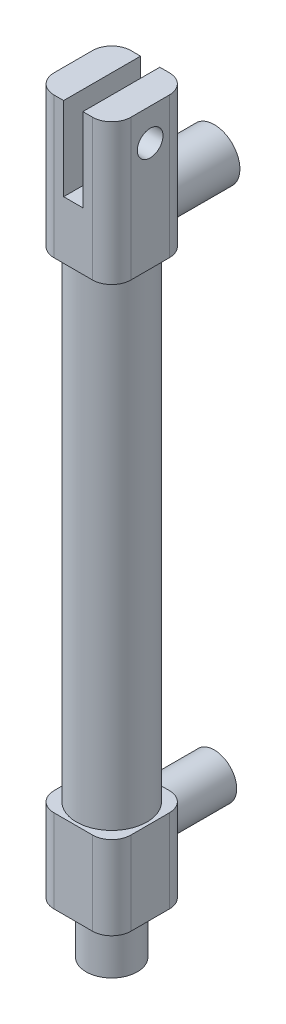
ISO-10303-21;
HEADER;
FILE_DESCRIPTION(('STEP AP214'),'2;1');
FILE_NAME('part.step','',(''),(''),'','','');
FILE_SCHEMA(('AUTOMOTIVE_DESIGN { 1 0 10303 214 1 1 1 1 }'));
ENDSEC;
DATA;
#1=APPLICATION_CONTEXT('core data for automotive mechanical design processes');
#2=APPLICATION_PROTOCOL_DEFINITION('international standard','automotive_design',2000,#1);
#3=PRODUCT_CONTEXT('',#1,'mechanical');
#4=PRODUCT('Part','Part','',(#3));
#5=PRODUCT_RELATED_PRODUCT_CATEGORY('part','',(#4));
#6=PRODUCT_DEFINITION_FORMATION('','',#4);
#7=PRODUCT_DEFINITION_CONTEXT('part definition',#1,'design');
#8=PRODUCT_DEFINITION('design','',#6,#7);
#9=PRODUCT_DEFINITION_SHAPE('','',#8);
#10=(LENGTH_UNIT() NAMED_UNIT(*) SI_UNIT(.MILLI.,.METRE.));
#11=(NAMED_UNIT(*) PLANE_ANGLE_UNIT() SI_UNIT($,.RADIAN.));
#12=(NAMED_UNIT(*) SI_UNIT($,.STERADIAN.) SOLID_ANGLE_UNIT());
#13=UNCERTAINTY_MEASURE_WITH_UNIT(LENGTH_MEASURE(1.E-05),#10,'distance_accuracy_value','');
#14=(GEOMETRIC_REPRESENTATION_CONTEXT(3) GLOBAL_UNCERTAINTY_ASSIGNED_CONTEXT((#13)) GLOBAL_UNIT_ASSIGNED_CONTEXT((#10,
#11,#12)) REPRESENTATION_CONTEXT('',''));
#15=CARTESIAN_POINT('',(0.,0.,0.));
#16=DIRECTION('',(0.,0.,1.));
#17=DIRECTION('',(1.,0.,0.));
#18=AXIS2_PLACEMENT_3D('',#15,#16,#17);
#19=CARTESIAN_POINT('',(-57.059570611941,-13.,-8.24925290826831));
#20=DIRECTION('',(0.,1.,0.));
#21=DIRECTION('',(0.,0.,1.));
#22=AXIS2_PLACEMENT_3D('',#19,#20,#21);
#23=PLANE('',#22);
#24=CARTESIAN_POINT('',(-57.059570611941,-13.,-8.24925290826831));
#25=DIRECTION('',(0.,-1.,0.));
#26=DIRECTION('',(0.,0.,1.));
#27=AXIS2_PLACEMENT_3D('',#24,#25,#26);
#28=CIRCLE('',#27,3.);
#29=CARTESIAN_POINT('',(-54.059570611941,-13.,-8.24925290826833));
#30=VERTEX_POINT('',#29);
#31=CARTESIAN_POINT('',(-57.059570611941,-13.,-5.24925290826831));
#32=VERTEX_POINT('',#31);
#33=EDGE_CURVE('E807',#30,#32,#28,.T.);
#34=ORIENTED_EDGE('',*,*,#33,.T.);
#35=DIRECTION('',(-1.,0.,0.));
#36=VECTOR('',#35,1.);
#37=CARTESIAN_POINT('',(-57.059570611941,-13.,-5.24925290826831));
#38=LINE('',#37,#36);
#39=CARTESIAN_POINT('',(-63.059570611941,-13.,-5.24925290826831));
#40=VERTEX_POINT('',#39);
#41=EDGE_CURVE('E809',#32,#40,#38,.T.);
#42=ORIENTED_EDGE('',*,*,#41,.T.);
#43=CARTESIAN_POINT('',(-63.059570611941,-13.,-8.24925290826831));
#44=DIRECTION('',(0.,-1.,0.));
#45=DIRECTION('',(0.,0.,-1.));
#46=AXIS2_PLACEMENT_3D('',#43,#44,#45);
#47=CIRCLE('',#46,3.);
#48=CARTESIAN_POINT('',(-66.059570611941,-13.,-8.24925290826833));
#49=VERTEX_POINT('',#48);
#50=EDGE_CURVE('E812',#40,#49,#47,.T.);
#51=ORIENTED_EDGE('',*,*,#50,.T.);
#52=DIRECTION('',(0.,0.,-1.));
#53=VECTOR('',#52,1.);
#54=CARTESIAN_POINT('',(-66.059570611941,-13.,-14.2492529082683));
#55=LINE('',#54,#53);
#56=CARTESIAN_POINT('',(-66.059570611941,-13.,-14.2492529082683));
#57=VERTEX_POINT('',#56);
#58=EDGE_CURVE('E814',#49,#57,#55,.T.);
#59=ORIENTED_EDGE('',*,*,#58,.T.);
#60=CARTESIAN_POINT('',(-63.059570611941,-13.,-14.2492529082683));
#61=DIRECTION('',(0.,-1.,0.));
#62=DIRECTION('',(0.,0.,-1.));
#63=AXIS2_PLACEMENT_3D('',#60,#61,#62);
#64=CIRCLE('',#63,3.);
#65=CARTESIAN_POINT('',(-63.059570611941,-13.,-17.2492529082683));
#66=VERTEX_POINT('',#65);
#67=EDGE_CURVE('E816',#57,#66,#64,.T.);
#68=ORIENTED_EDGE('',*,*,#67,.T.);
#69=DIRECTION('',(1.,0.,0.));
#70=VECTOR('',#69,1.);
#71=CARTESIAN_POINT('',(-57.059570611941,-13.,-17.2492529082683));
#72=LINE('',#71,#70);
#73=CARTESIAN_POINT('',(-57.059570611941,-13.,-17.2492529082683));
#74=VERTEX_POINT('',#73);
#75=EDGE_CURVE('E818',#66,#74,#72,.T.);
#76=ORIENTED_EDGE('',*,*,#75,.T.);
#77=CARTESIAN_POINT('',(-57.059570611941,-13.,-14.2492529082683));
#78=DIRECTION('',(0.,-1.,0.));
#79=DIRECTION('',(0.,0.,1.));
#80=AXIS2_PLACEMENT_3D('',#77,#78,#79);
#81=CIRCLE('',#80,3.);
#82=CARTESIAN_POINT('',(-54.059570611941,-13.,-14.2492529082683));
#83=VERTEX_POINT('',#82);
#84=EDGE_CURVE('E820',#74,#83,#81,.T.);
#85=ORIENTED_EDGE('',*,*,#84,.T.);
#86=DIRECTION('',(0.,0.,1.));
#87=VECTOR('',#86,1.);
#88=CARTESIAN_POINT('',(-54.059570611941,-13.,-14.2492529082683));
#89=LINE('',#88,#87);
#90=EDGE_CURVE('E822',#83,#30,#89,.T.);
#91=ORIENTED_EDGE('',*,*,#90,.T.);
#92=EDGE_LOOP('',(#34,#42,#51,#59,#68,#76,#85,#91));
#93=FACE_BOUND('',#92,.T.);
#94=CARTESIAN_POINT('',(-60.059570611941,-13.,-11.2492529082683));
#95=DIRECTION('',(0.,1.,0.));
#96=DIRECTION('',(0.,0.,1.));
#97=AXIS2_PLACEMENT_3D('',#94,#95,#96);
#98=CIRCLE('',#97,4.00000000000001);
#99=CARTESIAN_POINT('',(-60.059570611941,-13.,-7.2492529082683));
#100=VERTEX_POINT('',#99);
#101=EDGE_CURVE('E11',#100,#100,#98,.F.);
#102=ORIENTED_EDGE('',*,*,#101,.F.);
#103=EDGE_LOOP('',(#102));
#104=FACE_BOUND('',#103,.T.);
#105=ADVANCED_FACE('F32',(#93,#104),#23,.F.);
#106=CARTESIAN_POINT('',(-57.059570611941,-13.,-17.2492529082683));
#107=DIRECTION('',(0.,0.,1.));
#108=DIRECTION('',(1.,0.,0.));
#109=AXIS2_PLACEMENT_3D('',#106,#107,#108);
#110=PLANE('',#109);
#111=CARTESIAN_POINT('',(-60.059570611941,-4.5,-17.2492529082683));
#112=DIRECTION('',(0.,0.,-1.));
#113=DIRECTION('',(-1.,0.,0.));
#114=AXIS2_PLACEMENT_3D('',#111,#112,#113);
#115=CIRCLE('',#114,3.5);
#116=CARTESIAN_POINT('',(-57.059570611941,-6.30277563773199,-17.2492529082683));
#117=VERTEX_POINT('',#116);
#118=CARTESIAN_POINT('',(-63.059570611941,-6.30277563773202,-17.2492529082683));
#119=VERTEX_POINT('',#118);
#120=EDGE_CURVE('E209',#117,#119,#115,.T.);
#121=ORIENTED_EDGE('',*,*,#120,.F.);
#122=DIRECTION('',(0.,1.,0.));
#123=VECTOR('',#122,1.);
#124=CARTESIAN_POINT('',(-57.059570611941,-13.,-17.2492529082683));
#125=LINE('',#124,#123);
#126=EDGE_CURVE('E227',#74,#117,#125,.T.);
#127=ORIENTED_EDGE('',*,*,#126,.F.);
#128=ORIENTED_EDGE('',*,*,#75,.F.);
#129=DIRECTION('',(0.,1.,0.));
#130=VECTOR('',#129,1.);
#131=CARTESIAN_POINT('',(-63.059570611941,-13.,-17.2492529082683));
#132=LINE('',#131,#130);
#133=EDGE_CURVE('E226',#66,#119,#132,.T.);
#134=ORIENTED_EDGE('',*,*,#133,.T.);
#135=EDGE_LOOP('',(#121,#127,#128,#134));
#136=FACE_BOUND('',#135,.T.);
#137=ADVANCED_FACE('F385',(#136),#110,.F.);
#138=CARTESIAN_POINT('',(-63.059570611941,-2.69722436226798,-17.2492529082683));
#139=VERTEX_POINT('',#138);
#140=CARTESIAN_POINT('',(-57.059570611941,-2.69722436226801,-17.2492529082683));
#141=VERTEX_POINT('',#140);
#142=EDGE_CURVE('E47',#139,#141,#115,.T.);
#143=ORIENTED_EDGE('',*,*,#142,.F.);
#144=CARTESIAN_POINT('',(-63.059570611941,0.,-17.2492529082683));
#145=VERTEX_POINT('',#144);
#146=EDGE_CURVE('E216',#139,#145,#132,.T.);
#147=ORIENTED_EDGE('',*,*,#146,.T.);
#148=DIRECTION('',(1.,0.,0.));
#149=VECTOR('',#148,1.);
#150=CARTESIAN_POINT('',(-57.059570611941,0.,-17.2492529082683));
#151=LINE('',#150,#149);
#152=CARTESIAN_POINT('',(-57.059570611941,0.,-17.2492529082683));
#153=VERTEX_POINT('',#152);
#154=EDGE_CURVE('E834',#145,#153,#151,.T.);
#155=ORIENTED_EDGE('',*,*,#154,.T.);
#156=EDGE_CURVE('E218',#141,#153,#125,.T.);
#157=ORIENTED_EDGE('',*,*,#156,.F.);
#158=EDGE_LOOP('',(#143,#147,#155,#157));
#159=FACE_BOUND('',#158,.T.);
#160=ADVANCED_FACE('F214',(#159),#110,.F.);
#161=CARTESIAN_POINT('',(-63.059570611941,97.,-17.2492529082683));
#162=DIRECTION('',(0.,0.,1.));
#163=DIRECTION('',(1.,0.,0.));
#164=AXIS2_PLACEMENT_3D('',#161,#162,#163);
#165=PLANE('',#164);
#166=CARTESIAN_POINT('',(-60.059570611941,79.5,-17.2492529082683));
#167=DIRECTION('',(0.,0.,-1.));
#168=DIRECTION('',(-1.,0.,0.));
#169=AXIS2_PLACEMENT_3D('',#166,#167,#168);
#170=CIRCLE('',#169,4.);
#171=CARTESIAN_POINT('',(-57.059570611941,76.8542486889354,-17.2492529082683));
#172=VERTEX_POINT('',#171);
#173=CARTESIAN_POINT('',(-63.059570611941,76.8542486889354,-17.2492529082683));
#174=VERTEX_POINT('',#173);
#175=EDGE_CURVE('E55',#172,#174,#170,.T.);
#176=ORIENTED_EDGE('',*,*,#175,.F.);
#177=DIRECTION('',(0.,-1.,0.));
#178=VECTOR('',#177,1.);
#179=CARTESIAN_POINT('',(-57.059570611941,97.,-17.2492529082683));
#180=LINE('',#179,#178);
#181=CARTESIAN_POINT('',(-57.059570611941,75.,-17.2492529082683));
#182=VERTEX_POINT('',#181);
#183=EDGE_CURVE('E348',#172,#182,#180,.T.);
#184=ORIENTED_EDGE('',*,*,#183,.T.);
#185=DIRECTION('',(-1.,0.,0.));
#186=VECTOR('',#185,1.);
#187=CARTESIAN_POINT('',(-63.059570611941,75.,-17.2492529082683));
#188=LINE('',#187,#186);
#189=CARTESIAN_POINT('',(-63.059570611941,75.,-17.2492529082683));
#190=VERTEX_POINT('',#189);
#191=EDGE_CURVE('E323',#182,#190,#188,.T.);
#192=ORIENTED_EDGE('',*,*,#191,.T.);
#193=DIRECTION('',(0.,-1.,0.));
#194=VECTOR('',#193,1.);
#195=CARTESIAN_POINT('',(-63.059570611941,97.,-17.2492529082683));
#196=LINE('',#195,#194);
#197=EDGE_CURVE('E344',#174,#190,#196,.T.);
#198=ORIENTED_EDGE('',*,*,#197,.F.);
#199=EDGE_LOOP('',(#176,#184,#192,#198));
#200=FACE_BOUND('',#199,.T.);
#201=ADVANCED_FACE('F479',(#200),#165,.F.);
#202=CARTESIAN_POINT('',(-63.059570611941,82.1457513110646,-17.2492529082683));
#203=VERTEX_POINT('',#202);
#204=CARTESIAN_POINT('',(-57.059570611941,82.1457513110646,-17.2492529082683));
#205=VERTEX_POINT('',#204);
#206=EDGE_CURVE('E253',#203,#205,#170,.T.);
#207=ORIENTED_EDGE('',*,*,#206,.F.);
#208=CARTESIAN_POINT('',(-63.059570611941,97.,-17.2492529082683));
#209=VERTEX_POINT('',#208);
#210=EDGE_CURVE('E345',#209,#203,#196,.T.);
#211=ORIENTED_EDGE('',*,*,#210,.F.);
#212=DIRECTION('',(-1.,0.,0.));
#213=VECTOR('',#212,1.);
#214=CARTESIAN_POINT('',(-63.059570611941,97.,-17.2492529082683));
#215=LINE('',#214,#213);
#216=CARTESIAN_POINT('',(-61.559570611941,97.,-17.2492529082683));
#217=VERTEX_POINT('',#216);
#218=EDGE_CURVE('E301',#217,#209,#215,.T.);
#219=ORIENTED_EDGE('',*,*,#218,.F.);
#220=DIRECTION('',(0.,1.,0.));
#221=VECTOR('',#220,1.);
#222=CARTESIAN_POINT('',(-61.559570611941,84.,-17.2492529082683));
#223=LINE('',#222,#221);
#224=CARTESIAN_POINT('',(-61.559570611941,84.,-17.2492529082683));
#225=VERTEX_POINT('',#224);
#226=EDGE_CURVE('E281',#225,#217,#223,.T.);
#227=ORIENTED_EDGE('',*,*,#226,.F.);
#228=DIRECTION('',(-1.,0.,0.));
#229=VECTOR('',#228,1.);
#230=CARTESIAN_POINT('',(-61.559570611941,84.,-17.2492529082683));
#231=LINE('',#230,#229);
#232=CARTESIAN_POINT('',(-58.559570611941,84.,-17.2492529082683));
#233=VERTEX_POINT('',#232);
#234=EDGE_CURVE('E262',#233,#225,#231,.T.);
#235=ORIENTED_EDGE('',*,*,#234,.F.);
#236=DIRECTION('',(0.,1.,0.));
#237=VECTOR('',#236,1.);
#238=CARTESIAN_POINT('',(-58.559570611941,84.,-17.2492529082683));
#239=LINE('',#238,#237);
#240=CARTESIAN_POINT('',(-58.559570611941,97.,-17.2492529082683));
#241=VERTEX_POINT('',#240);
#242=EDGE_CURVE('E272',#233,#241,#239,.T.);
#243=ORIENTED_EDGE('',*,*,#242,.T.);
#244=CARTESIAN_POINT('',(-57.059570611941,97.,-17.2492529082683));
#245=VERTEX_POINT('',#244);
#246=EDGE_CURVE('E302',#245,#241,#215,.T.);
#247=ORIENTED_EDGE('',*,*,#246,.F.);
#248=EDGE_CURVE('E350',#245,#205,#180,.T.);
#249=ORIENTED_EDGE('',*,*,#248,.T.);
#250=EDGE_LOOP('',(#207,#211,#219,#227,#235,#243,#247,#249));
#251=FACE_BOUND('',#250,.T.);
#252=ADVANCED_FACE('F453',(#251),#165,.F.);
#253=CARTESIAN_POINT('',(-57.059570611941,97.,-8.24925290826831));
#254=DIRECTION('',(0.,-1.,0.));
#255=DIRECTION('',(0.,0.,-1.));
#256=AXIS2_PLACEMENT_3D('',#253,#254,#255);
#257=PLANE('',#256);
#258=ORIENTED_EDGE('',*,*,#246,.T.);
#259=DIRECTION('',(0.,0.,-1.));
#260=VECTOR('',#259,1.);
#261=CARTESIAN_POINT('',(-58.559570611941,97.,-17.2492529082683));
#262=LINE('',#261,#260);
#263=CARTESIAN_POINT('',(-58.559570611941,97.,-5.24925290826831));
#264=VERTEX_POINT('',#263);
#265=EDGE_CURVE('E258',#264,#241,#262,.T.);
#266=ORIENTED_EDGE('',*,*,#265,.F.);
#267=DIRECTION('',(1.,0.,0.));
#268=VECTOR('',#267,1.);
#269=CARTESIAN_POINT('',(-63.059570611941,97.,-5.24925290826831));
#270=LINE('',#269,#268);
#271=CARTESIAN_POINT('',(-57.059570611941,97.,-5.24925290826831));
#272=VERTEX_POINT('',#271);
#273=EDGE_CURVE('E311',#264,#272,#270,.T.);
#274=ORIENTED_EDGE('',*,*,#273,.T.);
#275=CARTESIAN_POINT('',(-57.059570611941,97.,-8.24925290826831));
#276=DIRECTION('',(0.,1.,0.));
#277=DIRECTION('',(0.,0.,-1.));
#278=AXIS2_PLACEMENT_3D('',#275,#276,#277);
#279=CIRCLE('',#278,3.);
#280=CARTESIAN_POINT('',(-54.059570611941,97.,-8.24925290826834));
#281=VERTEX_POINT('',#280);
#282=EDGE_CURVE('E293',#272,#281,#279,.T.);
#283=ORIENTED_EDGE('',*,*,#282,.T.);
#284=DIRECTION('',(0.,0.,-1.));
#285=VECTOR('',#284,1.);
#286=CARTESIAN_POINT('',(-54.059570611941,97.,-14.2492529082683));
#287=LINE('',#286,#285);
#288=CARTESIAN_POINT('',(-54.059570611941,97.,-14.2492529082683));
#289=VERTEX_POINT('',#288);
#290=EDGE_CURVE('E296',#281,#289,#287,.T.);
#291=ORIENTED_EDGE('',*,*,#290,.T.);
#292=CARTESIAN_POINT('',(-57.059570611941,97.,-14.2492529082683));
#293=DIRECTION('',(0.,1.,0.));
#294=DIRECTION('',(0.,0.,-1.));
#295=AXIS2_PLACEMENT_3D('',#292,#293,#294);
#296=CIRCLE('',#295,3.);
#297=EDGE_CURVE('E299',#289,#245,#296,.T.);
#298=ORIENTED_EDGE('',*,*,#297,.T.);
#299=EDGE_LOOP('',(#258,#266,#274,#283,#291,#298));
#300=FACE_BOUND('',#299,.T.);
#301=ADVANCED_FACE('F470',(#300),#257,.F.);
#302=CARTESIAN_POINT('',(-54.059570611941,92.,-11.2492529082683));
#303=DIRECTION('',(-1.,0.,0.));
#304=DIRECTION('',(0.,0.,1.));
#305=AXIS2_PLACEMENT_3D('',#302,#303,#304);
#306=CYLINDRICAL_SURFACE('',#305,2.);
#307=CARTESIAN_POINT('',(-58.559570611941,92.,-11.2492529082683));
#308=DIRECTION('',(1.,0.,0.));
#309=DIRECTION('',(0.,0.,-1.));
#310=AXIS2_PLACEMENT_3D('',#307,#308,#309);
#311=CIRCLE('',#310,2.);
#312=CARTESIAN_POINT('',(-58.559570611941,92.,-13.2492529082683));
#313=VERTEX_POINT('',#312);
#314=EDGE_CURVE('E292',#313,#313,#311,.F.);
#315=ORIENTED_EDGE('',*,*,#314,.T.);
#316=EDGE_LOOP('',(#315));
#317=FACE_BOUND('',#316,.T.);
#318=CARTESIAN_POINT('',(-54.059570611941,92.,-11.2492529082683));
#319=DIRECTION('',(-1.,0.,0.));
#320=DIRECTION('',(0.,0.,1.));
#321=AXIS2_PLACEMENT_3D('',#318,#319,#320);
#322=CIRCLE('',#321,2.);
#323=CARTESIAN_POINT('',(-54.059570611941,92.,-9.24925290826831));
#324=VERTEX_POINT('',#323);
#325=EDGE_CURVE('E285',#324,#324,#322,.T.);
#326=ORIENTED_EDGE('',*,*,#325,.F.);
#327=EDGE_LOOP('',(#326));
#328=FACE_BOUND('',#327,.T.);
#329=ADVANCED_FACE('F365',(#317,#328),#306,.F.);
#330=CARTESIAN_POINT('',(-60.059570611941,75.,-11.2492529082683));
#331=DIRECTION('',(0.,-1.,0.));
#332=DIRECTION('',(0.,0.,-1.));
#333=AXIS2_PLACEMENT_3D('',#330,#331,#332);
#334=CYLINDRICAL_SURFACE('',#333,5.5);
#335=CARTESIAN_POINT('',(-60.059570611941,75.,-11.2492529082683));
#336=DIRECTION('',(0.,1.,0.));
#337=DIRECTION('',(0.,0.,1.));
#338=AXIS2_PLACEMENT_3D('',#335,#336,#337);
#339=CIRCLE('',#338,5.5);
#340=CARTESIAN_POINT('',(-60.059570611941,75.,-5.74925290826831));
#341=VERTEX_POINT('',#340);
#342=EDGE_CURVE('E40',#341,#341,#339,.T.);
#343=ORIENTED_EDGE('',*,*,#342,.F.);
#344=EDGE_LOOP('',(#343));
#345=FACE_BOUND('',#344,.T.);
#346=CARTESIAN_POINT('',(-60.059570611941,0.,-11.2492529082683));
#347=DIRECTION('',(0.,1.,0.));
#348=DIRECTION('',(0.,0.,1.));
#349=AXIS2_PLACEMENT_3D('',#346,#347,#348);
#350=CIRCLE('',#349,5.5);
#351=CARTESIAN_POINT('',(-60.059570611941,0.,-5.74925290826831));
#352=VERTEX_POINT('',#351);
#353=EDGE_CURVE('E245',#352,#352,#350,.T.);
#354=ORIENTED_EDGE('',*,*,#353,.T.);
#355=EDGE_LOOP('',(#354));
#356=FACE_BOUND('',#355,.T.);
#357=ADVANCED_FACE('F34',(#345,#356),#334,.T.);
#358=CARTESIAN_POINT('',(-57.059570611941,75.,-8.24925290826831));
#359=DIRECTION('',(0.,-1.,0.));
#360=DIRECTION('',(0.,0.,-1.));
#361=AXIS2_PLACEMENT_3D('',#358,#359,#360);
#362=PLANE('',#361);
#363=CARTESIAN_POINT('',(-57.059570611941,75.,-8.24925290826831));
#364=DIRECTION('',(0.,1.,0.));
#365=DIRECTION('',(0.,0.,-1.));
#366=AXIS2_PLACEMENT_3D('',#363,#364,#365);
#367=CIRCLE('',#366,3.);
#368=CARTESIAN_POINT('',(-57.059570611941,75.,-5.24925290826831));
#369=VERTEX_POINT('',#368);
#370=CARTESIAN_POINT('',(-54.059570611941,75.,-8.24925290826834));
#371=VERTEX_POINT('',#370);
#372=EDGE_CURVE('E288',#369,#371,#367,.T.);
#373=ORIENTED_EDGE('',*,*,#372,.F.);
#374=DIRECTION('',(1.,0.,0.));
#375=VECTOR('',#374,1.);
#376=CARTESIAN_POINT('',(-63.059570611941,75.,-5.24925290826831));
#377=LINE('',#376,#375);
#378=CARTESIAN_POINT('',(-63.059570611941,75.,-5.24925290826831));
#379=VERTEX_POINT('',#378);
#380=EDGE_CURVE('E297',#379,#369,#377,.T.);
#381=ORIENTED_EDGE('',*,*,#380,.F.);
#382=CARTESIAN_POINT('',(-63.059570611941,75.,-8.24925290826831));
#383=DIRECTION('',(0.,1.,0.));
#384=DIRECTION('',(0.,0.,-1.));
#385=AXIS2_PLACEMENT_3D('',#382,#383,#384);
#386=CIRCLE('',#385,3.);
#387=CARTESIAN_POINT('',(-66.059570611941,75.,-8.24925290826834));
#388=VERTEX_POINT('',#387);
#389=EDGE_CURVE('E330',#388,#379,#386,.T.);
#390=ORIENTED_EDGE('',*,*,#389,.F.);
#391=DIRECTION('',(0.,0.,1.));
#392=VECTOR('',#391,1.);
#393=CARTESIAN_POINT('',(-66.059570611941,75.,-14.2492529082683));
#394=LINE('',#393,#392);
#395=CARTESIAN_POINT('',(-66.059570611941,75.,-14.2492529082683));
#396=VERTEX_POINT('',#395);
#397=EDGE_CURVE('E328',#396,#388,#394,.T.);
#398=ORIENTED_EDGE('',*,*,#397,.F.);
#399=CARTESIAN_POINT('',(-63.059570611941,75.,-14.2492529082683));
#400=DIRECTION('',(0.,1.,0.));
#401=DIRECTION('',(0.,0.,1.));
#402=AXIS2_PLACEMENT_3D('',#399,#400,#401);
#403=CIRCLE('',#402,3.);
#404=EDGE_CURVE('E326',#190,#396,#403,.T.);
#405=ORIENTED_EDGE('',*,*,#404,.F.);
#406=ORIENTED_EDGE('',*,*,#191,.F.);
#407=CARTESIAN_POINT('',(-57.059570611941,75.,-14.2492529082683));
#408=DIRECTION('',(0.,1.,0.));
#409=DIRECTION('',(0.,0.,-1.));
#410=AXIS2_PLACEMENT_3D('',#407,#408,#409);
#411=CIRCLE('',#410,3.);
#412=CARTESIAN_POINT('',(-54.059570611941,75.,-14.2492529082683));
#413=VERTEX_POINT('',#412);
#414=EDGE_CURVE('E320',#413,#182,#411,.T.);
#415=ORIENTED_EDGE('',*,*,#414,.F.);
#416=DIRECTION('',(0.,0.,-1.));
#417=VECTOR('',#416,1.);
#418=CARTESIAN_POINT('',(-54.059570611941,75.,-14.2492529082683));
#419=LINE('',#418,#417);
#420=EDGE_CURVE('E318',#371,#413,#419,.T.);
#421=ORIENTED_EDGE('',*,*,#420,.F.);
#422=EDGE_LOOP('',(#373,#381,#390,#398,#405,#406,#415,#421));
#423=FACE_BOUND('',#422,.T.);
#424=ORIENTED_EDGE('',*,*,#342,.T.);
#425=EDGE_LOOP('',(#424));
#426=FACE_BOUND('',#425,.T.);
#427=ADVANCED_FACE('F490',(#423,#426),#362,.T.);
#428=CARTESIAN_POINT('',(-57.059570611941,97.,-8.24925290826831));
#429=DIRECTION('',(0.,-1.,0.));
#430=DIRECTION('',(0.,0.,-1.));
#431=AXIS2_PLACEMENT_3D('',#428,#429,#430);
#432=CYLINDRICAL_SURFACE('',#431,3.);
#433=ORIENTED_EDGE('',*,*,#372,.T.);
#434=DIRECTION('',(0.,-1.,0.));
#435=VECTOR('',#434,1.);
#436=CARTESIAN_POINT('',(-54.059570611941,97.,-8.24925290826834));
#437=LINE('',#436,#435);
#438=EDGE_CURVE('E356',#281,#371,#437,.T.);
#439=ORIENTED_EDGE('',*,*,#438,.F.);
#440=ORIENTED_EDGE('',*,*,#282,.F.);
#441=DIRECTION('',(0.,-1.,0.));
#442=VECTOR('',#441,1.);
#443=CARTESIAN_POINT('',(-57.059570611941,97.,-5.24925290826831));
#444=LINE('',#443,#442);
#445=EDGE_CURVE('E315',#272,#369,#444,.T.);
#446=ORIENTED_EDGE('',*,*,#445,.T.);
#447=EDGE_LOOP('',(#433,#439,#440,#446));
#448=FACE_BOUND('',#447,.T.);
#449=ADVANCED_FACE('F518',(#448),#432,.T.);
#450=CARTESIAN_POINT('',(-54.059570611941,97.,-14.2492529082683));
#451=DIRECTION('',(-1.,0.,0.));
#452=DIRECTION('',(0.,0.,1.));
#453=AXIS2_PLACEMENT_3D('',#450,#451,#452);
#454=PLANE('',#453);
#455=ORIENTED_EDGE('',*,*,#325,.T.);
#456=EDGE_LOOP('',(#455));
#457=FACE_BOUND('',#456,.T.);
#458=ORIENTED_EDGE('',*,*,#420,.T.);
#459=DIRECTION('',(0.,-1.,0.));
#460=VECTOR('',#459,1.);
#461=CARTESIAN_POINT('',(-54.059570611941,97.,-14.2492529082683));
#462=LINE('',#461,#460);
#463=EDGE_CURVE('E353',#289,#413,#462,.T.);
#464=ORIENTED_EDGE('',*,*,#463,.F.);
#465=ORIENTED_EDGE('',*,*,#290,.F.);
#466=ORIENTED_EDGE('',*,*,#438,.T.);
#467=EDGE_LOOP('',(#458,#464,#465,#466));
#468=FACE_BOUND('',#467,.T.);
#469=ADVANCED_FACE('F516',(#457,#468),#454,.F.);
#470=CARTESIAN_POINT('',(-57.059570611941,97.,-14.2492529082683));
#471=DIRECTION('',(0.,-1.,0.));
#472=DIRECTION('',(0.,0.,-1.));
#473=AXIS2_PLACEMENT_3D('',#470,#471,#472);
#474=CYLINDRICAL_SURFACE('',#473,3.);
#475=ORIENTED_EDGE('',*,*,#414,.T.);
#476=ORIENTED_EDGE('',*,*,#183,.F.);
#477=DIRECTION('',(0.,-1.,0.));
#478=VECTOR('',#477,1.);
#479=CARTESIAN_POINT('',(-57.059570611941,97.,-17.2492529082683));
#480=LINE('',#479,#478);
#481=EDGE_CURVE('E252',#205,#172,#480,.T.);
#482=ORIENTED_EDGE('',*,*,#481,.F.);
#483=ORIENTED_EDGE('',*,*,#248,.F.);
#484=ORIENTED_EDGE('',*,*,#297,.F.);
#485=ORIENTED_EDGE('',*,*,#463,.T.);
#486=EDGE_LOOP('',(#475,#476,#482,#483,#484,#485));
#487=FACE_BOUND('',#486,.T.);
#488=ADVANCED_FACE('F475',(#487),#474,.T.);
#489=CARTESIAN_POINT('',(-63.059570611941,97.,-14.2492529082683));
#490=DIRECTION('',(0.,-1.,0.));
#491=DIRECTION('',(0.,0.,-1.));
#492=AXIS2_PLACEMENT_3D('',#489,#490,#491);
#493=CYLINDRICAL_SURFACE('',#492,3.);
#494=ORIENTED_EDGE('',*,*,#404,.T.);
#495=DIRECTION('',(0.,-1.,0.));
#496=VECTOR('',#495,1.);
#497=CARTESIAN_POINT('',(-66.059570611941,97.,-14.2492529082683));
#498=LINE('',#497,#496);
#499=CARTESIAN_POINT('',(-66.059570611941,97.,-14.2492529082683));
#500=VERTEX_POINT('',#499);
#501=EDGE_CURVE('E341',#500,#396,#498,.T.);
#502=ORIENTED_EDGE('',*,*,#501,.F.);
#503=CARTESIAN_POINT('',(-63.059570611941,97.,-14.2492529082683));
#504=DIRECTION('',(0.,1.,0.));
#505=DIRECTION('',(0.,0.,1.));
#506=AXIS2_PLACEMENT_3D('',#503,#504,#505);
#507=CIRCLE('',#506,3.);
#508=EDGE_CURVE('E305',#209,#500,#507,.T.);
#509=ORIENTED_EDGE('',*,*,#508,.F.);
#510=ORIENTED_EDGE('',*,*,#210,.T.);
#511=EDGE_CURVE('E349',#203,#174,#196,.T.);
#512=ORIENTED_EDGE('',*,*,#511,.T.);
#513=ORIENTED_EDGE('',*,*,#197,.T.);
#514=EDGE_LOOP('',(#494,#502,#509,#510,#512,#513));
#515=FACE_BOUND('',#514,.T.);
#516=ADVANCED_FACE('F482',(#515),#493,.T.);
#517=CARTESIAN_POINT('',(-66.059570611941,97.,-14.2492529082683));
#518=DIRECTION('',(1.,0.,0.));
#519=DIRECTION('',(0.,0.,-1.));
#520=AXIS2_PLACEMENT_3D('',#517,#518,#519);
#521=PLANE('',#520);
#522=CARTESIAN_POINT('',(-66.059570611941,92.,-11.2492529082683));
#523=DIRECTION('',(-1.,0.,0.));
#524=DIRECTION('',(0.,0.,1.));
#525=AXIS2_PLACEMENT_3D('',#522,#523,#524);
#526=CIRCLE('',#525,2.);
#527=CARTESIAN_POINT('',(-66.059570611941,92.,-9.24925290826831));
#528=VERTEX_POINT('',#527);
#529=EDGE_CURVE('E289',#528,#528,#526,.T.);
#530=ORIENTED_EDGE('',*,*,#529,.F.);
#531=EDGE_LOOP('',(#530));
#532=FACE_BOUND('',#531,.T.);
#533=ORIENTED_EDGE('',*,*,#397,.T.);
#534=DIRECTION('',(0.,-1.,0.));
#535=VECTOR('',#534,1.);
#536=CARTESIAN_POINT('',(-66.059570611941,97.,-8.24925290826834));
#537=LINE('',#536,#535);
#538=CARTESIAN_POINT('',(-66.059570611941,97.,-8.24925290826834));
#539=VERTEX_POINT('',#538);
#540=EDGE_CURVE('E338',#539,#388,#537,.T.);
#541=ORIENTED_EDGE('',*,*,#540,.F.);
#542=DIRECTION('',(0.,0.,1.));
#543=VECTOR('',#542,1.);
#544=CARTESIAN_POINT('',(-66.059570611941,97.,-14.2492529082683));
#545=LINE('',#544,#543);
#546=EDGE_CURVE('E307',#500,#539,#545,.T.);
#547=ORIENTED_EDGE('',*,*,#546,.F.);
#548=ORIENTED_EDGE('',*,*,#501,.T.);
#549=EDGE_LOOP('',(#533,#541,#547,#548));
#550=FACE_BOUND('',#549,.T.);
#551=ADVANCED_FACE('F495',(#532,#550),#521,.F.);
#552=CARTESIAN_POINT('',(-63.059570611941,97.,-8.24925290826831));
#553=DIRECTION('',(0.,-1.,0.));
#554=DIRECTION('',(0.,0.,-1.));
#555=AXIS2_PLACEMENT_3D('',#552,#553,#554);
#556=CYLINDRICAL_SURFACE('',#555,3.);
#557=ORIENTED_EDGE('',*,*,#389,.T.);
#558=DIRECTION('',(0.,-1.,0.));
#559=VECTOR('',#558,1.);
#560=CARTESIAN_POINT('',(-63.059570611941,97.,-5.24925290826831));
#561=LINE('',#560,#559);
#562=CARTESIAN_POINT('',(-63.059570611941,97.,-5.24925290826831));
#563=VERTEX_POINT('',#562);
#564=EDGE_CURVE('E335',#563,#379,#561,.T.);
#565=ORIENTED_EDGE('',*,*,#564,.F.);
#566=CARTESIAN_POINT('',(-63.059570611941,97.,-8.24925290826831));
#567=DIRECTION('',(0.,1.,0.));
#568=DIRECTION('',(0.,0.,-1.));
#569=AXIS2_PLACEMENT_3D('',#566,#567,#568);
#570=CIRCLE('',#569,3.);
#571=EDGE_CURVE('E309',#539,#563,#570,.T.);
#572=ORIENTED_EDGE('',*,*,#571,.F.);
#573=ORIENTED_EDGE('',*,*,#540,.T.);
#574=EDGE_LOOP('',(#557,#565,#572,#573));
#575=FACE_BOUND('',#574,.T.);
#576=ADVANCED_FACE('F498',(#575),#556,.T.);
#577=CARTESIAN_POINT('',(-63.059570611941,97.,-5.24925290826831));
#578=DIRECTION('',(0.,0.,-1.));
#579=DIRECTION('',(-1.,0.,0.));
#580=AXIS2_PLACEMENT_3D('',#577,#578,#579);
#581=PLANE('',#580);
#582=ORIENTED_EDGE('',*,*,#273,.F.);
#583=DIRECTION('',(0.,1.,0.));
#584=VECTOR('',#583,1.);
#585=CARTESIAN_POINT('',(-58.559570611941,84.,-5.24925290826831));
#586=LINE('',#585,#584);
#587=CARTESIAN_POINT('',(-58.559570611941,84.,-5.24925290826831));
#588=VERTEX_POINT('',#587);
#589=EDGE_CURVE('E275',#588,#264,#586,.T.);
#590=ORIENTED_EDGE('',*,*,#589,.F.);
#591=DIRECTION('',(1.,0.,0.));
#592=VECTOR('',#591,1.);
#593=CARTESIAN_POINT('',(-61.559570611941,84.,-5.24925290826831));
#594=LINE('',#593,#592);
#595=CARTESIAN_POINT('',(-61.559570611941,84.,-5.24925290826831));
#596=VERTEX_POINT('',#595);
#597=EDGE_CURVE('E269',#596,#588,#594,.T.);
#598=ORIENTED_EDGE('',*,*,#597,.F.);
#599=DIRECTION('',(0.,1.,0.));
#600=VECTOR('',#599,1.);
#601=CARTESIAN_POINT('',(-61.559570611941,84.,-5.24925290826831));
#602=LINE('',#601,#600);
#603=CARTESIAN_POINT('',(-61.559570611941,97.,-5.24925290826831));
#604=VERTEX_POINT('',#603);
#605=EDGE_CURVE('E278',#596,#604,#602,.T.);
#606=ORIENTED_EDGE('',*,*,#605,.T.);
#607=EDGE_CURVE('E312',#563,#604,#270,.T.);
#608=ORIENTED_EDGE('',*,*,#607,.F.);
#609=ORIENTED_EDGE('',*,*,#564,.T.);
#610=ORIENTED_EDGE('',*,*,#380,.T.);
#611=ORIENTED_EDGE('',*,*,#445,.F.);
#612=EDGE_LOOP('',(#582,#590,#598,#606,#608,#609,#610,#611));
#613=FACE_BOUND('',#612,.T.);
#614=ADVANCED_FACE('F465',(#613),#581,.F.);
#615=ORIENTED_EDGE('',*,*,#607,.T.);
#616=DIRECTION('',(0.,0.,1.));
#617=VECTOR('',#616,1.);
#618=CARTESIAN_POINT('',(-61.559570611941,97.,-17.2492529082683));
#619=LINE('',#618,#617);
#620=EDGE_CURVE('E263',#217,#604,#619,.T.);
#621=ORIENTED_EDGE('',*,*,#620,.F.);
#622=ORIENTED_EDGE('',*,*,#218,.T.);
#623=ORIENTED_EDGE('',*,*,#508,.T.);
#624=ORIENTED_EDGE('',*,*,#546,.T.);
#625=ORIENTED_EDGE('',*,*,#571,.T.);
#626=EDGE_LOOP('',(#615,#621,#622,#623,#624,#625));
#627=FACE_BOUND('',#626,.T.);
#628=ADVANCED_FACE('F381',(#627),#257,.F.);
#629=CARTESIAN_POINT('',(-61.559570611941,92.,-11.2492529082683));
#630=DIRECTION('',(-1.,0.,0.));
#631=DIRECTION('',(0.,0.,1.));
#632=AXIS2_PLACEMENT_3D('',#629,#630,#631);
#633=CIRCLE('',#632,2.);
#634=CARTESIAN_POINT('',(-61.559570611941,92.,-9.24925290826831));
#635=VERTEX_POINT('',#634);
#636=EDGE_CURVE('E277',#635,#635,#633,.F.);
#637=ORIENTED_EDGE('',*,*,#636,.T.);
#638=EDGE_LOOP('',(#637));
#639=FACE_BOUND('',#638,.T.);
#640=ORIENTED_EDGE('',*,*,#529,.T.);
#641=EDGE_LOOP('',(#640));
#642=FACE_BOUND('',#641,.T.);
#643=ADVANCED_FACE('F371',(#639,#642),#306,.F.);
#644=CARTESIAN_POINT('',(-58.559570611941,84.,-17.2492529082683));
#645=DIRECTION('',(1.,0.,0.));
#646=DIRECTION('',(0.,0.,-1.));
#647=AXIS2_PLACEMENT_3D('',#644,#645,#646);
#648=PLANE('',#647);
#649=ORIENTED_EDGE('',*,*,#265,.T.);
#650=ORIENTED_EDGE('',*,*,#242,.F.);
#651=DIRECTION('',(0.,0.,-1.));
#652=VECTOR('',#651,1.);
#653=CARTESIAN_POINT('',(-58.559570611941,84.,-17.2492529082683));
#654=LINE('',#653,#652);
#655=EDGE_CURVE('E259',#588,#233,#654,.T.);
#656=ORIENTED_EDGE('',*,*,#655,.F.);
#657=ORIENTED_EDGE('',*,*,#589,.T.);
#658=EDGE_LOOP('',(#649,#650,#656,#657));
#659=FACE_BOUND('',#658,.T.);
#660=ORIENTED_EDGE('',*,*,#314,.F.);
#661=EDGE_LOOP('',(#660));
#662=FACE_BOUND('',#661,.T.);
#663=ADVANCED_FACE('F368',(#659,#662),#648,.F.);
#664=CARTESIAN_POINT('',(-61.559570611941,84.,-17.2492529082683));
#665=DIRECTION('',(-1.,0.,0.));
#666=DIRECTION('',(0.,0.,1.));
#667=AXIS2_PLACEMENT_3D('',#664,#665,#666);
#668=PLANE('',#667);
#669=ORIENTED_EDGE('',*,*,#620,.T.);
#670=ORIENTED_EDGE('',*,*,#605,.F.);
#671=DIRECTION('',(0.,0.,1.));
#672=VECTOR('',#671,1.);
#673=CARTESIAN_POINT('',(-61.559570611941,84.,-17.2492529082683));
#674=LINE('',#673,#672);
#675=EDGE_CURVE('E266',#225,#596,#674,.T.);
#676=ORIENTED_EDGE('',*,*,#675,.F.);
#677=ORIENTED_EDGE('',*,*,#226,.T.);
#678=EDGE_LOOP('',(#669,#670,#676,#677));
#679=FACE_BOUND('',#678,.T.);
#680=ORIENTED_EDGE('',*,*,#636,.F.);
#681=EDGE_LOOP('',(#680));
#682=FACE_BOUND('',#681,.T.);
#683=ADVANCED_FACE('F370',(#679,#682),#668,.F.);
#684=CARTESIAN_POINT('',(-58.559570611941,84.,-5.24925290826831));
#685=DIRECTION('',(0.,1.,0.));
#686=DIRECTION('',(0.,0.,1.));
#687=AXIS2_PLACEMENT_3D('',#684,#685,#686);
#688=PLANE('',#687);
#689=ORIENTED_EDGE('',*,*,#655,.T.);
#690=ORIENTED_EDGE('',*,*,#234,.T.);
#691=ORIENTED_EDGE('',*,*,#675,.T.);
#692=ORIENTED_EDGE('',*,*,#597,.T.);
#693=EDGE_LOOP('',(#689,#690,#691,#692));
#694=FACE_BOUND('',#693,.T.);
#695=ADVANCED_FACE('F378',(#694),#688,.T.);
#696=CARTESIAN_POINT('',(-60.059570611941,79.5,-17.2492529082683));
#697=DIRECTION('',(0.,0.,-1.));
#698=DIRECTION('',(-1.,0.,0.));
#699=AXIS2_PLACEMENT_3D('',#696,#697,#698);
#700=PLANE('',#699);
#701=EDGE_CURVE('E256',#205,#172,#170,.T.);
#702=ORIENTED_EDGE('',*,*,#701,.F.);
#703=ORIENTED_EDGE('',*,*,#481,.T.);
#704=EDGE_LOOP('',(#702,#703));
#705=FACE_BOUND('',#704,.T.);
#706=ADVANCED_FACE('F437',(#705),#700,.F.);
#707=CARTESIAN_POINT('',(-60.059570611941,79.5,-27.2492529082683));
#708=DIRECTION('',(0.,0.,1.));
#709=DIRECTION('',(1.,0.,0.));
#710=AXIS2_PLACEMENT_3D('',#707,#708,#709);
#711=CYLINDRICAL_SURFACE('',#710,4.);
#712=CARTESIAN_POINT('',(-60.059570611941,79.5,-27.2492529082683));
#713=DIRECTION('',(0.,0.,-1.));
#714=DIRECTION('',(-1.,0.,0.));
#715=AXIS2_PLACEMENT_3D('',#712,#713,#714);
#716=CIRCLE('',#715,4.);
#717=CARTESIAN_POINT('',(-64.059570611941,79.5,-27.2492529082683));
#718=VERTEX_POINT('',#717);
#719=EDGE_CURVE('E249',#718,#718,#716,.T.);
#720=ORIENTED_EDGE('',*,*,#719,.F.);
#721=EDGE_LOOP('',(#720));
#722=FACE_BOUND('',#721,.T.);
#723=ORIENTED_EDGE('',*,*,#206,.T.);
#724=ORIENTED_EDGE('',*,*,#701,.T.);
#725=ORIENTED_EDGE('',*,*,#175,.T.);
#726=EDGE_CURVE('E248',#174,#203,#170,.T.);
#727=ORIENTED_EDGE('',*,*,#726,.T.);
#728=EDGE_LOOP('',(#723,#724,#725,#727));
#729=FACE_BOUND('',#728,.T.);
#730=ADVANCED_FACE('F432',(#722,#729),#711,.T.);
#731=CARTESIAN_POINT('',(-60.059570611941,79.5,-27.2492529082683));
#732=DIRECTION('',(0.,0.,-1.));
#733=DIRECTION('',(-1.,0.,0.));
#734=AXIS2_PLACEMENT_3D('',#731,#732,#733);
#735=PLANE('',#734);
#736=ORIENTED_EDGE('',*,*,#719,.T.);
#737=EDGE_LOOP('',(#736));
#738=FACE_BOUND('',#737,.T.);
#739=ADVANCED_FACE('F429',(#738),#735,.T.);
#740=ORIENTED_EDGE('',*,*,#511,.F.);
#741=ORIENTED_EDGE('',*,*,#726,.F.);
#742=EDGE_LOOP('',(#740,#741));
#743=FACE_BOUND('',#742,.T.);
#744=ADVANCED_FACE('F402',(#743),#700,.F.);
#745=CARTESIAN_POINT('',(-57.059570611941,0.,-8.24925290826831));
#746=DIRECTION('',(0.,1.,0.));
#747=DIRECTION('',(0.,0.,1.));
#748=AXIS2_PLACEMENT_3D('',#745,#746,#747);
#749=PLANE('',#748);
#750=CARTESIAN_POINT('',(-57.059570611941,0.,-8.24925290826831));
#751=DIRECTION('',(0.,-1.,0.));
#752=DIRECTION('',(0.,0.,1.));
#753=AXIS2_PLACEMENT_3D('',#750,#751,#752);
#754=CIRCLE('',#753,3.);
#755=CARTESIAN_POINT('',(-54.059570611941,0.,-8.24925290826833));
#756=VERTEX_POINT('',#755);
#757=CARTESIAN_POINT('',(-57.059570611941,0.,-5.24925290826831));
#758=VERTEX_POINT('',#757);
#759=EDGE_CURVE('E204',#756,#758,#754,.T.);
#760=ORIENTED_EDGE('',*,*,#759,.F.);
#761=DIRECTION('',(0.,0.,1.));
#762=VECTOR('',#761,1.);
#763=CARTESIAN_POINT('',(-54.059570611941,0.,-14.2492529082683));
#764=LINE('',#763,#762);
#765=CARTESIAN_POINT('',(-54.059570611941,0.,-14.2492529082683));
#766=VERTEX_POINT('',#765);
#767=EDGE_CURVE('E810',#766,#756,#764,.T.);
#768=ORIENTED_EDGE('',*,*,#767,.F.);
#769=CARTESIAN_POINT('',(-57.059570611941,0.,-14.2492529082683));
#770=DIRECTION('',(0.,-1.,0.));
#771=DIRECTION('',(0.,0.,1.));
#772=AXIS2_PLACEMENT_3D('',#769,#770,#771);
#773=CIRCLE('',#772,3.);
#774=EDGE_CURVE('E836',#153,#766,#773,.T.);
#775=ORIENTED_EDGE('',*,*,#774,.F.);
#776=ORIENTED_EDGE('',*,*,#154,.F.);
#777=CARTESIAN_POINT('',(-63.059570611941,0.,-14.2492529082683));
#778=DIRECTION('',(0.,-1.,0.));
#779=DIRECTION('',(0.,0.,-1.));
#780=AXIS2_PLACEMENT_3D('',#777,#778,#779);
#781=CIRCLE('',#780,3.);
#782=CARTESIAN_POINT('',(-66.059570611941,0.,-14.2492529082683));
#783=VERTEX_POINT('',#782);
#784=EDGE_CURVE('E224',#783,#145,#781,.T.);
#785=ORIENTED_EDGE('',*,*,#784,.F.);
#786=DIRECTION('',(0.,0.,-1.));
#787=VECTOR('',#786,1.);
#788=CARTESIAN_POINT('',(-66.059570611941,0.,-14.2492529082683));
#789=LINE('',#788,#787);
#790=CARTESIAN_POINT('',(-66.059570611941,0.,-8.24925290826833));
#791=VERTEX_POINT('',#790);
#792=EDGE_CURVE('E831',#791,#783,#789,.T.);
#793=ORIENTED_EDGE('',*,*,#792,.F.);
#794=CARTESIAN_POINT('',(-63.059570611941,0.,-8.24925290826831));
#795=DIRECTION('',(0.,-1.,0.));
#796=DIRECTION('',(0.,0.,-1.));
#797=AXIS2_PLACEMENT_3D('',#794,#795,#796);
#798=CIRCLE('',#797,3.);
#799=CARTESIAN_POINT('',(-63.059570611941,0.,-5.24925290826831));
#800=VERTEX_POINT('',#799);
#801=EDGE_CURVE('E829',#800,#791,#798,.T.);
#802=ORIENTED_EDGE('',*,*,#801,.F.);
#803=DIRECTION('',(-1.,0.,0.));
#804=VECTOR('',#803,1.);
#805=CARTESIAN_POINT('',(-57.059570611941,0.,-5.24925290826831));
#806=LINE('',#805,#804);
#807=EDGE_CURVE('E827',#758,#800,#806,.T.);
#808=ORIENTED_EDGE('',*,*,#807,.F.);
#809=EDGE_LOOP('',(#760,#768,#775,#776,#785,#793,#802,#808));
#810=FACE_BOUND('',#809,.T.);
#811=ORIENTED_EDGE('',*,*,#353,.F.);
#812=EDGE_LOOP('',(#811));
#813=FACE_BOUND('',#812,.T.);
#814=ADVANCED_FACE('F398',(#810,#813),#749,.T.);
#815=CARTESIAN_POINT('',(-57.059570611941,-13.,-8.24925290826831));
#816=DIRECTION('',(0.,1.,0.));
#817=DIRECTION('',(0.,0.,1.));
#818=AXIS2_PLACEMENT_3D('',#815,#816,#817);
#819=CYLINDRICAL_SURFACE('',#818,3.);
#820=ORIENTED_EDGE('',*,*,#759,.T.);
#821=DIRECTION('',(0.,1.,0.));
#822=VECTOR('',#821,1.);
#823=CARTESIAN_POINT('',(-57.059570611941,-13.,-5.24925290826831));
#824=LINE('',#823,#822);
#825=EDGE_CURVE('E242',#32,#758,#824,.T.);
#826=ORIENTED_EDGE('',*,*,#825,.F.);
#827=ORIENTED_EDGE('',*,*,#33,.F.);
#828=DIRECTION('',(0.,1.,0.));
#829=VECTOR('',#828,1.);
#830=CARTESIAN_POINT('',(-54.059570611941,-13.,-8.24925290826833));
#831=LINE('',#830,#829);
#832=EDGE_CURVE('E824',#30,#756,#831,.T.);
#833=ORIENTED_EDGE('',*,*,#832,.T.);
#834=EDGE_LOOP('',(#820,#826,#827,#833));
#835=FACE_BOUND('',#834,.T.);
#836=ADVANCED_FACE('F401',(#835),#819,.T.);
#837=CARTESIAN_POINT('',(-57.059570611941,-13.,-5.24925290826831));
#838=DIRECTION('',(0.,0.,-1.));
#839=DIRECTION('',(-1.,0.,0.));
#840=AXIS2_PLACEMENT_3D('',#837,#838,#839);
#841=PLANE('',#840);
#842=ORIENTED_EDGE('',*,*,#807,.T.);
#843=DIRECTION('',(0.,1.,0.));
#844=VECTOR('',#843,1.);
#845=CARTESIAN_POINT('',(-63.059570611941,-13.,-5.24925290826831));
#846=LINE('',#845,#844);
#847=EDGE_CURVE('E239',#40,#800,#846,.T.);
#848=ORIENTED_EDGE('',*,*,#847,.F.);
#849=ORIENTED_EDGE('',*,*,#41,.F.);
#850=ORIENTED_EDGE('',*,*,#825,.T.);
#851=EDGE_LOOP('',(#842,#848,#849,#850));
#852=FACE_BOUND('',#851,.T.);
#853=ADVANCED_FACE('F421',(#852),#841,.F.);
#854=CARTESIAN_POINT('',(-63.059570611941,-13.,-8.24925290826831));
#855=DIRECTION('',(0.,1.,0.));
#856=DIRECTION('',(0.,0.,1.));
#857=AXIS2_PLACEMENT_3D('',#854,#855,#856);
#858=CYLINDRICAL_SURFACE('',#857,3.);
#859=ORIENTED_EDGE('',*,*,#801,.T.);
#860=DIRECTION('',(0.,1.,0.));
#861=VECTOR('',#860,1.);
#862=CARTESIAN_POINT('',(-66.059570611941,-13.,-8.24925290826833));
#863=LINE('',#862,#861);
#864=EDGE_CURVE('E236',#49,#791,#863,.T.);
#865=ORIENTED_EDGE('',*,*,#864,.F.);
#866=ORIENTED_EDGE('',*,*,#50,.F.);
#867=ORIENTED_EDGE('',*,*,#847,.T.);
#868=EDGE_LOOP('',(#859,#865,#866,#867));
#869=FACE_BOUND('',#868,.T.);
#870=ADVANCED_FACE('F417',(#869),#858,.T.);
#871=CARTESIAN_POINT('',(-66.059570611941,-13.,-14.2492529082683));
#872=DIRECTION('',(1.,0.,0.));
#873=DIRECTION('',(0.,0.,-1.));
#874=AXIS2_PLACEMENT_3D('',#871,#872,#873);
#875=PLANE('',#874);
#876=ORIENTED_EDGE('',*,*,#792,.T.);
#877=DIRECTION('',(0.,1.,0.));
#878=VECTOR('',#877,1.);
#879=CARTESIAN_POINT('',(-66.059570611941,-13.,-14.2492529082683));
#880=LINE('',#879,#878);
#881=EDGE_CURVE('E229',#57,#783,#880,.T.);
#882=ORIENTED_EDGE('',*,*,#881,.F.);
#883=ORIENTED_EDGE('',*,*,#58,.F.);
#884=ORIENTED_EDGE('',*,*,#864,.T.);
#885=EDGE_LOOP('',(#876,#882,#883,#884));
#886=FACE_BOUND('',#885,.T.);
#887=ADVANCED_FACE('F414',(#886),#875,.F.);
#888=CARTESIAN_POINT('',(-63.059570611941,-13.,-14.2492529082683));
#889=DIRECTION('',(0.,1.,0.));
#890=DIRECTION('',(0.,0.,1.));
#891=AXIS2_PLACEMENT_3D('',#888,#889,#890);
#892=CYLINDRICAL_SURFACE('',#891,3.);
#893=ORIENTED_EDGE('',*,*,#784,.T.);
#894=ORIENTED_EDGE('',*,*,#146,.F.);
#895=DIRECTION('',(0.,1.,0.));
#896=VECTOR('',#895,1.);
#897=CARTESIAN_POINT('',(-63.059570611941,-13.,-17.2492529082683));
#898=LINE('',#897,#896);
#899=EDGE_CURVE('E196',#119,#139,#898,.T.);
#900=ORIENTED_EDGE('',*,*,#899,.F.);
#901=ORIENTED_EDGE('',*,*,#133,.F.);
#902=ORIENTED_EDGE('',*,*,#67,.F.);
#903=ORIENTED_EDGE('',*,*,#881,.T.);
#904=EDGE_LOOP('',(#893,#894,#900,#901,#902,#903));
#905=FACE_BOUND('',#904,.T.);
#906=ADVANCED_FACE('F221',(#905),#892,.T.);
#907=CARTESIAN_POINT('',(-57.059570611941,-13.,-14.2492529082683));
#908=DIRECTION('',(0.,1.,0.));
#909=DIRECTION('',(0.,0.,1.));
#910=AXIS2_PLACEMENT_3D('',#907,#908,#909);
#911=CYLINDRICAL_SURFACE('',#910,3.);
#912=ORIENTED_EDGE('',*,*,#774,.T.);
#913=DIRECTION('',(0.,1.,0.));
#914=VECTOR('',#913,1.);
#915=CARTESIAN_POINT('',(-54.059570611941,-13.,-14.2492529082683));
#916=LINE('',#915,#914);
#917=EDGE_CURVE('E840',#83,#766,#916,.T.);
#918=ORIENTED_EDGE('',*,*,#917,.F.);
#919=ORIENTED_EDGE('',*,*,#84,.F.);
#920=ORIENTED_EDGE('',*,*,#126,.T.);
#921=EDGE_CURVE('E231',#117,#141,#125,.T.);
#922=ORIENTED_EDGE('',*,*,#921,.T.);
#923=ORIENTED_EDGE('',*,*,#156,.T.);
#924=EDGE_LOOP('',(#912,#918,#919,#920,#922,#923));
#925=FACE_BOUND('',#924,.T.);
#926=ADVANCED_FACE('F407',(#925),#911,.T.);
#927=CARTESIAN_POINT('',(-54.059570611941,-13.,-14.2492529082683));
#928=DIRECTION('',(-1.,0.,0.));
#929=DIRECTION('',(0.,0.,1.));
#930=AXIS2_PLACEMENT_3D('',#927,#928,#929);
#931=PLANE('',#930);
#932=ORIENTED_EDGE('',*,*,#767,.T.);
#933=ORIENTED_EDGE('',*,*,#832,.F.);
#934=ORIENTED_EDGE('',*,*,#90,.F.);
#935=ORIENTED_EDGE('',*,*,#917,.T.);
#936=EDGE_LOOP('',(#932,#933,#934,#935));
#937=FACE_BOUND('',#936,.T.);
#938=ADVANCED_FACE('F404',(#937),#931,.F.);
#939=CARTESIAN_POINT('',(-60.059570611941,-4.5,-17.2492529082683));
#940=DIRECTION('',(0.,0.,-1.));
#941=DIRECTION('',(-1.,0.,0.));
#942=AXIS2_PLACEMENT_3D('',#939,#940,#941);
#943=PLANE('',#942);
#944=EDGE_CURVE('E198',#119,#139,#115,.T.);
#945=ORIENTED_EDGE('',*,*,#944,.F.);
#946=ORIENTED_EDGE('',*,*,#899,.T.);
#947=EDGE_LOOP('',(#945,#946));
#948=FACE_BOUND('',#947,.T.);
#949=ADVANCED_FACE('F197',(#948),#943,.F.);
#950=CARTESIAN_POINT('',(-60.059570611941,-4.5,-27.2492529082683));
#951=DIRECTION('',(0.,0.,1.));
#952=DIRECTION('',(1.,0.,0.));
#953=AXIS2_PLACEMENT_3D('',#950,#951,#952);
#954=CYLINDRICAL_SURFACE('',#953,3.5);
#955=CARTESIAN_POINT('',(-60.059570611941,-4.5,-27.2492529082683));
#956=DIRECTION('',(0.,0.,-1.));
#957=DIRECTION('',(-1.,0.,0.));
#958=AXIS2_PLACEMENT_3D('',#955,#956,#957);
#959=CIRCLE('',#958,3.5);
#960=CARTESIAN_POINT('',(-63.559570611941,-4.5,-27.2492529082683));
#961=VERTEX_POINT('',#960);
#962=EDGE_CURVE('E205',#961,#961,#959,.T.);
#963=ORIENTED_EDGE('',*,*,#962,.F.);
#964=EDGE_LOOP('',(#963));
#965=FACE_BOUND('',#964,.T.);
#966=ORIENTED_EDGE('',*,*,#142,.T.);
#967=EDGE_CURVE('E220',#141,#117,#115,.T.);
#968=ORIENTED_EDGE('',*,*,#967,.T.);
#969=ORIENTED_EDGE('',*,*,#120,.T.);
#970=ORIENTED_EDGE('',*,*,#944,.T.);
#971=EDGE_LOOP('',(#966,#968,#969,#970));
#972=FACE_BOUND('',#971,.T.);
#973=ADVANCED_FACE('F207',(#965,#972),#954,.T.);
#974=CARTESIAN_POINT('',(-60.059570611941,-4.5,-27.2492529082683));
#975=DIRECTION('',(0.,0.,-1.));
#976=DIRECTION('',(-1.,0.,0.));
#977=AXIS2_PLACEMENT_3D('',#974,#975,#976);
#978=PLANE('',#977);
#979=ORIENTED_EDGE('',*,*,#962,.T.);
#980=EDGE_LOOP('',(#979));
#981=FACE_BOUND('',#980,.T.);
#982=ADVANCED_FACE('F730',(#981),#978,.T.);
#983=ORIENTED_EDGE('',*,*,#921,.F.);
#984=ORIENTED_EDGE('',*,*,#967,.F.);
#985=EDGE_LOOP('',(#983,#984));
#986=FACE_BOUND('',#985,.T.);
#987=ADVANCED_FACE('F722',(#986),#943,.F.);
#988=CARTESIAN_POINT('',(-60.059570611941,-21.,-11.2492529082683));
#989=DIRECTION('',(0.,1.,0.));
#990=DIRECTION('',(0.,0.,1.));
#991=AXIS2_PLACEMENT_3D('',#988,#989,#990);
#992=CYLINDRICAL_SURFACE('',#991,4.00000000000001);
#993=CARTESIAN_POINT('',(-60.059570611941,-21.,-11.2492529082683));
#994=DIRECTION('',(0.,-1.,0.));
#995=DIRECTION('',(0.,0.,-1.));
#996=AXIS2_PLACEMENT_3D('',#993,#994,#995);
#997=CIRCLE('',#996,4.00000000000001);
#998=CARTESIAN_POINT('',(-60.059570611941,-21.,-15.2492529082683));
#999=VERTEX_POINT('',#998);
#1000=EDGE_CURVE('E210',#999,#999,#997,.T.);
#1001=ORIENTED_EDGE('',*,*,#1000,.F.);
#1002=EDGE_LOOP('',(#1001));
#1003=FACE_BOUND('',#1002,.T.);
#1004=ORIENTED_EDGE('',*,*,#101,.T.);
#1005=EDGE_LOOP('',(#1004));
#1006=FACE_BOUND('',#1005,.T.);
#1007=ADVANCED_FACE('F747',(#1003,#1006),#992,.T.);
#1008=CARTESIAN_POINT('',(-60.059570611941,-21.,-11.2492529082683));
#1009=DIRECTION('',(0.,-1.,0.));
#1010=DIRECTION('',(0.,0.,-1.));
#1011=AXIS2_PLACEMENT_3D('',#1008,#1009,#1010);
#1012=PLANE('',#1011);
#1013=CARTESIAN_POINT('',(-60.059570611941,-21.,-11.2492529082683));
#1014=DIRECTION('',(0.,-1.,0.));
#1015=DIRECTION('',(0.,0.,-1.));
#1016=AXIS2_PLACEMENT_3D('',#1013,#1014,#1015);
#1017=CIRCLE('',#1016,2.);
#1018=CARTESIAN_POINT('',(-60.059570611941,-21.,-13.2492529082683));
#1019=VERTEX_POINT('',#1018);
#1020=EDGE_CURVE('E798',#1019,#1019,#1017,.T.);
#1021=ORIENTED_EDGE('',*,*,#1020,.F.);
#1022=EDGE_LOOP('',(#1021));
#1023=FACE_BOUND('',#1022,.T.);
#1024=ORIENTED_EDGE('',*,*,#1000,.T.);
#1025=EDGE_LOOP('',(#1024));
#1026=FACE_BOUND('',#1025,.T.);
#1027=ADVANCED_FACE('F761',(#1023,#1026),#1012,.T.);
#1028=CARTESIAN_POINT('',(-60.059570611941,59.,-11.2492529082683));
#1029=DIRECTION('',(0.,-1.,0.));
#1030=DIRECTION('',(0.,0.,-1.));
#1031=AXIS2_PLACEMENT_3D('',#1028,#1029,#1030);
#1032=CYLINDRICAL_SURFACE('',#1031,2.);
#1033=CARTESIAN_POINT('',(-60.059570611941,59.,-11.2492529082683));
#1034=DIRECTION('',(0.,-1.,0.));
#1035=DIRECTION('',(0.,0.,-1.));
#1036=AXIS2_PLACEMENT_3D('',#1033,#1034,#1035);
#1037=CIRCLE('',#1036,2.);
#1038=CARTESIAN_POINT('',(-60.059570611941,59.,-13.2492529082683));
#1039=VERTEX_POINT('',#1038);
#1040=EDGE_CURVE('E797',#1039,#1039,#1037,.T.);
#1041=ORIENTED_EDGE('',*,*,#1040,.F.);
#1042=EDGE_LOOP('',(#1041));
#1043=FACE_BOUND('',#1042,.T.);
#1044=ORIENTED_EDGE('',*,*,#1020,.T.);
#1045=EDGE_LOOP('',(#1044));
#1046=FACE_BOUND('',#1045,.T.);
#1047=ADVANCED_FACE('F771',(#1043,#1046),#1032,.F.);
#1048=CARTESIAN_POINT('',(-60.059570611941,59.,-11.2492529082683));
#1049=DIRECTION('',(0.,-1.,0.));
#1050=DIRECTION('',(0.,0.,-1.));
#1051=AXIS2_PLACEMENT_3D('',#1048,#1049,#1050);
#1052=PLANE('',#1051);
#1053=ORIENTED_EDGE('',*,*,#1040,.T.);
#1054=EDGE_LOOP('',(#1053));
#1055=FACE_BOUND('',#1054,.T.);
#1056=ADVANCED_FACE('F781',(#1055),#1052,.T.);
#1057=CLOSED_SHELL('',(#105,#137,#160,#201,#252,#301,#329,#357,#427,#449,#469,#488,#516,#551,
#576,#614,#628,#643,#663,#683,#695,#706,#730,#739,#744,#814,#836,#853,#870,#887,#906,#926,#938,
#949,#973,#982,#987,#1007,#1027,#1047,#1056));
#1058=MANIFOLD_SOLID_BREP('B2',#1057);
#1059=ADVANCED_BREP_SHAPE_REPRESENTATION('',(#18,#1058),#14);
#1060=SHAPE_DEFINITION_REPRESENTATION(#9,#1059);
ENDSEC;
END-ISO-10303-21;
